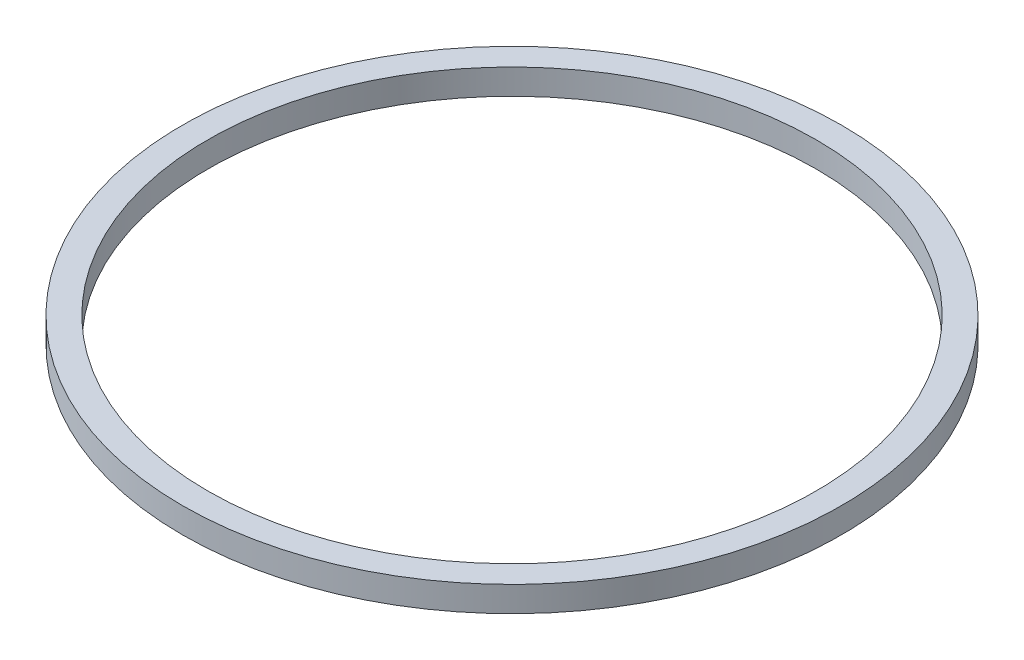
ISO-10303-21;
HEADER;
FILE_DESCRIPTION(('STEP AP214'),'2;1');
FILE_NAME('part.step','',(''),(''),'','','');
FILE_SCHEMA(('AUTOMOTIVE_DESIGN { 1 0 10303 214 1 1 1 1 }'));
ENDSEC;
DATA;
#1=APPLICATION_CONTEXT('core data for automotive mechanical design processes');
#2=APPLICATION_PROTOCOL_DEFINITION('international standard','automotive_design',2000,#1);
#3=PRODUCT_CONTEXT('',#1,'mechanical');
#4=PRODUCT('Part','Part','',(#3));
#5=PRODUCT_RELATED_PRODUCT_CATEGORY('part','',(#4));
#6=PRODUCT_DEFINITION_FORMATION('','',#4);
#7=PRODUCT_DEFINITION_CONTEXT('part definition',#1,'design');
#8=PRODUCT_DEFINITION('design','',#6,#7);
#9=PRODUCT_DEFINITION_SHAPE('','',#8);
#10=(LENGTH_UNIT() NAMED_UNIT(*) SI_UNIT(.MILLI.,.METRE.));
#11=(NAMED_UNIT(*) PLANE_ANGLE_UNIT() SI_UNIT($,.RADIAN.));
#12=(NAMED_UNIT(*) SI_UNIT($,.STERADIAN.) SOLID_ANGLE_UNIT());
#13=UNCERTAINTY_MEASURE_WITH_UNIT(LENGTH_MEASURE(1.E-05),#10,'distance_accuracy_value','');
#14=(GEOMETRIC_REPRESENTATION_CONTEXT(3) GLOBAL_UNCERTAINTY_ASSIGNED_CONTEXT((#13)) GLOBAL_UNIT_ASSIGNED_CONTEXT((#10,
#11,#12)) REPRESENTATION_CONTEXT('',''));
#15=CARTESIAN_POINT('',(0.,0.,0.));
#16=DIRECTION('',(0.,0.,1.));
#17=DIRECTION('',(1.,0.,0.));
#18=AXIS2_PLACEMENT_3D('',#15,#16,#17);
#19=CARTESIAN_POINT('',(0.,10.,0.));
#20=DIRECTION('',(0.,1.,0.));
#21=DIRECTION('',(0.,0.,1.));
#22=AXIS2_PLACEMENT_3D('',#19,#20,#21);
#23=PLANE('',#22);
#24=CARTESIAN_POINT('',(0.,10.,0.));
#25=DIRECTION('',(0.,1.,0.));
#26=DIRECTION('',(0.,0.,1.));
#27=AXIS2_PLACEMENT_3D('',#24,#25,#26);
#28=CIRCLE('',#27,130.);
#29=CARTESIAN_POINT('',(0.,10.,130.));
#30=VERTEX_POINT('',#29);
#31=EDGE_CURVE('E10',#30,#30,#28,.T.);
#32=ORIENTED_EDGE('',*,*,#31,.T.);
#33=EDGE_LOOP('',(#32));
#34=FACE_BOUND('',#33,.T.);
#35=CARTESIAN_POINT('',(0.,10.,0.));
#36=DIRECTION('',(0.,1.,0.));
#37=DIRECTION('',(0.,0.,1.));
#38=AXIS2_PLACEMENT_3D('',#35,#36,#37);
#39=CIRCLE('',#38,120.);
#40=CARTESIAN_POINT('',(0.,10.,120.));
#41=VERTEX_POINT('',#40);
#42=EDGE_CURVE('E42',#41,#41,#39,.T.);
#43=ORIENTED_EDGE('',*,*,#42,.F.);
#44=EDGE_LOOP('',(#43));
#45=FACE_BOUND('',#44,.T.);
#46=ADVANCED_FACE('F31',(#34,#45),#23,.T.);
#47=CARTESIAN_POINT('',(0.,0.,0.));
#48=DIRECTION('',(0.,1.,0.));
#49=DIRECTION('',(0.,0.,1.));
#50=AXIS2_PLACEMENT_3D('',#47,#48,#49);
#51=PLANE('',#50);
#52=CARTESIAN_POINT('',(0.,0.,0.));
#53=DIRECTION('',(0.,1.,0.));
#54=DIRECTION('',(0.,0.,1.));
#55=AXIS2_PLACEMENT_3D('',#52,#53,#54);
#56=CIRCLE('',#55,130.);
#57=CARTESIAN_POINT('',(0.,0.,130.));
#58=VERTEX_POINT('',#57);
#59=EDGE_CURVE('E35',#58,#58,#56,.T.);
#60=ORIENTED_EDGE('',*,*,#59,.F.);
#61=EDGE_LOOP('',(#60));
#62=FACE_BOUND('',#61,.T.);
#63=CARTESIAN_POINT('',(0.,0.,0.));
#64=DIRECTION('',(0.,1.,0.));
#65=DIRECTION('',(0.,0.,1.));
#66=AXIS2_PLACEMENT_3D('',#63,#64,#65);
#67=CIRCLE('',#66,120.);
#68=CARTESIAN_POINT('',(0.,0.,120.));
#69=VERTEX_POINT('',#68);
#70=EDGE_CURVE('E44',#69,#69,#67,.T.);
#71=ORIENTED_EDGE('',*,*,#70,.T.);
#72=EDGE_LOOP('',(#71));
#73=FACE_BOUND('',#72,.T.);
#74=ADVANCED_FACE('F54',(#62,#73),#51,.F.);
#75=CARTESIAN_POINT('',(0.,10.,0.));
#76=DIRECTION('',(0.,-1.,0.));
#77=DIRECTION('',(0.,0.,-1.));
#78=AXIS2_PLACEMENT_3D('',#75,#76,#77);
#79=CYLINDRICAL_SURFACE('',#78,130.);
#80=ORIENTED_EDGE('',*,*,#31,.F.);
#81=EDGE_LOOP('',(#80));
#82=FACE_BOUND('',#81,.T.);
#83=ORIENTED_EDGE('',*,*,#59,.T.);
#84=EDGE_LOOP('',(#83));
#85=FACE_BOUND('',#84,.T.);
#86=ADVANCED_FACE('F33',(#82,#85),#79,.T.);
#87=CARTESIAN_POINT('',(0.,10.,0.));
#88=DIRECTION('',(0.,-1.,0.));
#89=DIRECTION('',(0.,0.,-1.));
#90=AXIS2_PLACEMENT_3D('',#87,#88,#89);
#91=CYLINDRICAL_SURFACE('',#90,120.);
#92=ORIENTED_EDGE('',*,*,#42,.T.);
#93=EDGE_LOOP('',(#92));
#94=FACE_BOUND('',#93,.T.);
#95=ORIENTED_EDGE('',*,*,#70,.F.);
#96=EDGE_LOOP('',(#95));
#97=FACE_BOUND('',#96,.T.);
#98=ADVANCED_FACE('F50',(#94,#97),#91,.F.);
#99=CLOSED_SHELL('',(#46,#74,#86,#98));
#100=MANIFOLD_SOLID_BREP('B2',#99);
#101=ADVANCED_BREP_SHAPE_REPRESENTATION('',(#18,#100),#14);
#102=SHAPE_DEFINITION_REPRESENTATION(#9,#101);
ENDSEC;
END-ISO-10303-21;
